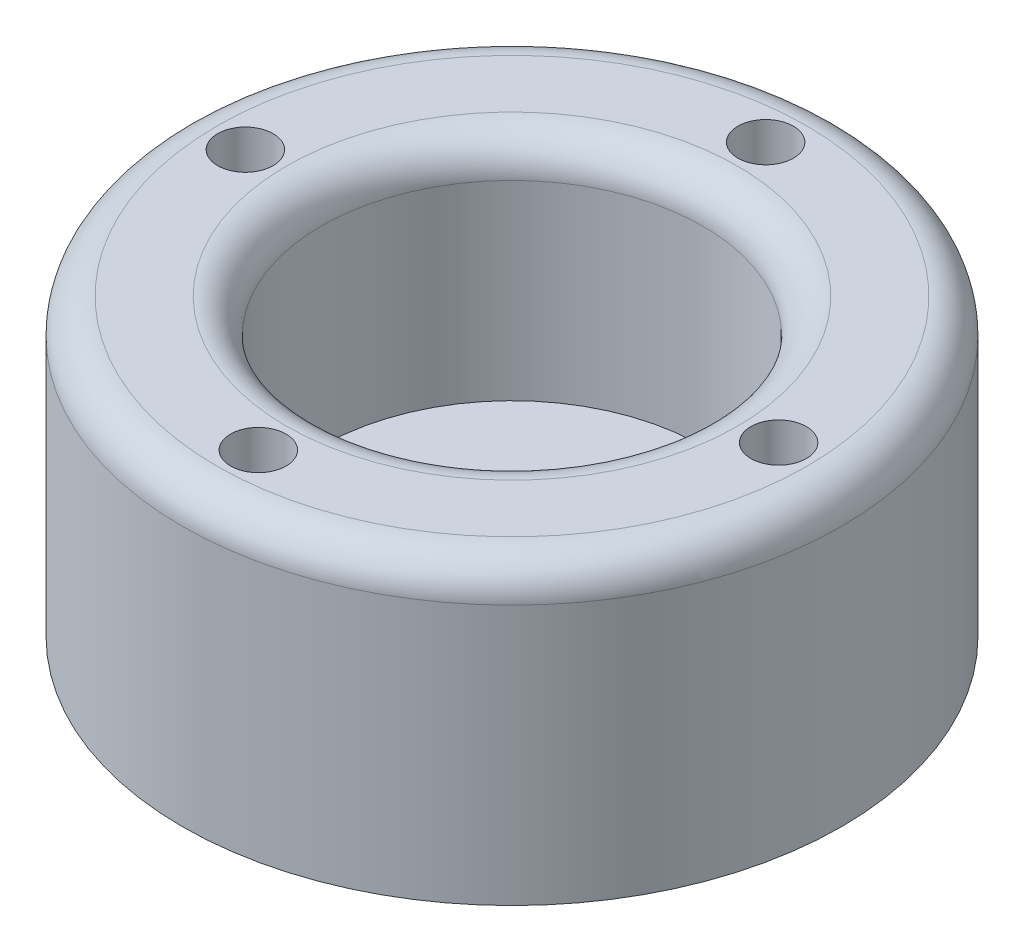
ISO-10303-21;
HEADER;
FILE_DESCRIPTION(('STEP AP214'),'2;1');
FILE_NAME('part.step','',(''),(''),'','','');
FILE_SCHEMA(('AUTOMOTIVE_DESIGN { 1 0 10303 214 1 1 1 1 }'));
ENDSEC;
DATA;
#1=APPLICATION_CONTEXT('core data for automotive mechanical design processes');
#2=APPLICATION_PROTOCOL_DEFINITION('international standard','automotive_design',2000,#1);
#3=PRODUCT_CONTEXT('',#1,'mechanical');
#4=PRODUCT('Part','Part','',(#3));
#5=PRODUCT_RELATED_PRODUCT_CATEGORY('part','',(#4));
#6=PRODUCT_DEFINITION_FORMATION('','',#4);
#7=PRODUCT_DEFINITION_CONTEXT('part definition',#1,'design');
#8=PRODUCT_DEFINITION('design','',#6,#7);
#9=PRODUCT_DEFINITION_SHAPE('','',#8);
#10=(LENGTH_UNIT() NAMED_UNIT(*) SI_UNIT(.MILLI.,.METRE.));
#11=(NAMED_UNIT(*) PLANE_ANGLE_UNIT() SI_UNIT($,.RADIAN.));
#12=(NAMED_UNIT(*) SI_UNIT($,.STERADIAN.) SOLID_ANGLE_UNIT());
#13=UNCERTAINTY_MEASURE_WITH_UNIT(LENGTH_MEASURE(1.E-05),#10,'distance_accuracy_value','');
#14=(GEOMETRIC_REPRESENTATION_CONTEXT(3) GLOBAL_UNCERTAINTY_ASSIGNED_CONTEXT((#13)) GLOBAL_UNIT_ASSIGNED_CONTEXT((#10,
#11,#12)) REPRESENTATION_CONTEXT('',''));
#15=CARTESIAN_POINT('',(0.,0.,0.));
#16=DIRECTION('',(0.,0.,1.));
#17=DIRECTION('',(1.,0.,0.));
#18=AXIS2_PLACEMENT_3D('',#15,#16,#17);
#19=CARTESIAN_POINT('',(0.,17.,0.));
#20=DIRECTION('',(0.,-1.,0.));
#21=DIRECTION('',(0.,0.,-1.));
#22=AXIS2_PLACEMENT_3D('',#19,#20,#21);
#23=CYLINDRICAL_SURFACE('',#22,4.75);
#24=CARTESIAN_POINT('',(0.,0.,0.));
#25=DIRECTION('',(0.,1.,0.));
#26=DIRECTION('',(0.,0.,1.));
#27=AXIS2_PLACEMENT_3D('',#24,#25,#26);
#28=CIRCLE('',#27,4.75);
#29=CARTESIAN_POINT('',(0.,0.,4.75));
#30=VERTEX_POINT('',#29);
#31=EDGE_CURVE('E65',#30,#30,#28,.T.);
#32=ORIENTED_EDGE('',*,*,#31,.F.);
#33=EDGE_LOOP('',(#32));
#34=FACE_BOUND('',#33,.T.);
#35=CARTESIAN_POINT('',(0.,4.,0.));
#36=DIRECTION('',(0.,1.,0.));
#37=DIRECTION('',(0.,0.,1.));
#38=AXIS2_PLACEMENT_3D('',#35,#36,#37);
#39=CIRCLE('',#38,4.75);
#40=CARTESIAN_POINT('',(0.,4.,4.75));
#41=VERTEX_POINT('',#40);
#42=EDGE_CURVE('E129',#41,#41,#39,.F.);
#43=ORIENTED_EDGE('',*,*,#42,.F.);
#44=EDGE_LOOP('',(#43));
#45=FACE_BOUND('',#44,.T.);
#46=ADVANCED_FACE('F37',(#34,#45),#23,.F.);
#47=CARTESIAN_POINT('',(-7.24999999999979,0.,0.373838073698017));
#48=DIRECTION('',(0.,1.,0.));
#49=DIRECTION('',(0.,0.,1.));
#50=AXIS2_PLACEMENT_3D('',#47,#48,#49);
#51=CYLINDRICAL_SURFACE('',#50,1.25000000000033);
#52=CARTESIAN_POINT('',(-7.24999999999979,0.,0.373838073698017));
#53=DIRECTION('',(0.,1.,0.));
#54=DIRECTION('',(0.,0.,1.));
#55=AXIS2_PLACEMENT_3D('',#52,#53,#54);
#56=CIRCLE('',#55,1.25000000000033);
#57=CARTESIAN_POINT('',(-7.24999999999979,0.,1.62383807369834));
#58=VERTEX_POINT('',#57);
#59=EDGE_CURVE('E70',#58,#58,#56,.T.);
#60=ORIENTED_EDGE('',*,*,#59,.F.);
#61=EDGE_LOOP('',(#60));
#62=FACE_BOUND('',#61,.T.);
#63=CARTESIAN_POINT('',(-7.24999999999979,4.,0.373838073698017));
#64=DIRECTION('',(0.,1.,0.));
#65=DIRECTION('',(0.,0.,1.));
#66=AXIS2_PLACEMENT_3D('',#63,#64,#65);
#67=CIRCLE('',#66,1.25000000000033);
#68=CARTESIAN_POINT('',(-7.24999999999979,4.,1.62383807369834));
#69=VERTEX_POINT('',#68);
#70=EDGE_CURVE('E125',#69,#69,#67,.F.);
#71=ORIENTED_EDGE('',*,*,#70,.F.);
#72=EDGE_LOOP('',(#71));
#73=FACE_BOUND('',#72,.T.);
#74=ADVANCED_FACE('F164',(#62,#73),#51,.F.);
#75=CARTESIAN_POINT('',(0.373838073698231,0.,7.24999999999998));
#76=DIRECTION('',(0.,1.,0.));
#77=DIRECTION('',(0.,0.,1.));
#78=AXIS2_PLACEMENT_3D('',#75,#76,#77);
#79=CYLINDRICAL_SURFACE('',#78,1.25000000000045);
#80=CARTESIAN_POINT('',(0.373838073698231,0.,7.24999999999998));
#81=DIRECTION('',(0.,1.,0.));
#82=DIRECTION('',(0.,0.,1.));
#83=AXIS2_PLACEMENT_3D('',#80,#81,#82);
#84=CIRCLE('',#83,1.25000000000045);
#85=CARTESIAN_POINT('',(0.373838073698231,0.,8.50000000000043));
#86=VERTEX_POINT('',#85);
#87=EDGE_CURVE('E74',#86,#86,#84,.T.);
#88=ORIENTED_EDGE('',*,*,#87,.F.);
#89=EDGE_LOOP('',(#88));
#90=FACE_BOUND('',#89,.T.);
#91=CARTESIAN_POINT('',(0.373838073698231,4.,7.24999999999998));
#92=DIRECTION('',(0.,1.,0.));
#93=DIRECTION('',(0.,0.,1.));
#94=AXIS2_PLACEMENT_3D('',#91,#92,#93);
#95=CIRCLE('',#94,1.25000000000045);
#96=CARTESIAN_POINT('',(0.373838073698231,4.,8.50000000000043));
#97=VERTEX_POINT('',#96);
#98=EDGE_CURVE('E133',#97,#97,#95,.F.);
#99=ORIENTED_EDGE('',*,*,#98,.F.);
#100=EDGE_LOOP('',(#99));
#101=FACE_BOUND('',#100,.T.);
#102=ADVANCED_FACE('F158',(#90,#101),#79,.F.);
#103=CARTESIAN_POINT('',(7.2500000000002,0.,-0.373838073698035));
#104=DIRECTION('',(0.,1.,0.));
#105=DIRECTION('',(0.,0.,1.));
#106=AXIS2_PLACEMENT_3D('',#103,#104,#105);
#107=CYLINDRICAL_SURFACE('',#106,1.25000000000017);
#108=CARTESIAN_POINT('',(7.2500000000002,0.,-0.373838073698035));
#109=DIRECTION('',(0.,1.,0.));
#110=DIRECTION('',(0.,0.,1.));
#111=AXIS2_PLACEMENT_3D('',#108,#109,#110);
#112=CIRCLE('',#111,1.25000000000017);
#113=CARTESIAN_POINT('',(7.2500000000002,0.,0.876161926302138));
#114=VERTEX_POINT('',#113);
#115=EDGE_CURVE('E79',#114,#114,#112,.T.);
#116=ORIENTED_EDGE('',*,*,#115,.F.);
#117=EDGE_LOOP('',(#116));
#118=FACE_BOUND('',#117,.T.);
#119=CARTESIAN_POINT('',(7.2500000000002,4.,-0.373838073698035));
#120=DIRECTION('',(0.,1.,0.));
#121=DIRECTION('',(0.,0.,1.));
#122=AXIS2_PLACEMENT_3D('',#119,#120,#121);
#123=CIRCLE('',#122,1.25000000000017);
#124=CARTESIAN_POINT('',(7.2500000000002,4.,0.876161926302138));
#125=VERTEX_POINT('',#124);
#126=EDGE_CURVE('E121',#125,#125,#123,.F.);
#127=ORIENTED_EDGE('',*,*,#126,.F.);
#128=EDGE_LOOP('',(#127));
#129=FACE_BOUND('',#128,.T.);
#130=ADVANCED_FACE('F148',(#118,#129),#107,.F.);
#131=CARTESIAN_POINT('',(-0.37383807369782,0.,-7.25));
#132=DIRECTION('',(0.,1.,0.));
#133=DIRECTION('',(0.,0.,1.));
#134=AXIS2_PLACEMENT_3D('',#131,#132,#133);
#135=CYLINDRICAL_SURFACE('',#134,1.25);
#136=CARTESIAN_POINT('',(-0.37383807369782,0.,-7.25));
#137=DIRECTION('',(0.,1.,0.));
#138=DIRECTION('',(0.,0.,1.));
#139=AXIS2_PLACEMENT_3D('',#136,#137,#138);
#140=CIRCLE('',#139,1.25);
#141=CARTESIAN_POINT('',(-0.37383807369782,0.,-6.));
#142=VERTEX_POINT('',#141);
#143=EDGE_CURVE('E69',#142,#142,#140,.T.);
#144=ORIENTED_EDGE('',*,*,#143,.F.);
#145=EDGE_LOOP('',(#144));
#146=FACE_BOUND('',#145,.T.);
#147=CARTESIAN_POINT('',(-0.37383807369782,4.,-7.25));
#148=DIRECTION('',(0.,1.,0.));
#149=DIRECTION('',(0.,0.,1.));
#150=AXIS2_PLACEMENT_3D('',#147,#148,#149);
#151=CIRCLE('',#150,1.25);
#152=CARTESIAN_POINT('',(-0.37383807369782,4.,-6.));
#153=VERTEX_POINT('',#152);
#154=EDGE_CURVE('E137',#153,#153,#151,.F.);
#155=ORIENTED_EDGE('',*,*,#154,.F.);
#156=EDGE_LOOP('',(#155));
#157=FACE_BOUND('',#156,.T.);
#158=ADVANCED_FACE('F145',(#146,#157),#135,.F.);
#159=CARTESIAN_POINT('',(0.,17.,0.));
#160=DIRECTION('',(0.,1.,0.));
#161=DIRECTION('',(0.,0.,1.));
#162=AXIS2_PLACEMENT_3D('',#159,#160,#161);
#163=PLANE('',#162);
#164=CARTESIAN_POINT('',(0.,17.,0.));
#165=DIRECTION('',(0.,1.,0.));
#166=DIRECTION('',(0.,0.,1.));
#167=AXIS2_PLACEMENT_3D('',#164,#165,#166);
#168=CIRCLE('',#167,17.);
#169=CARTESIAN_POINT('',(0.,17.,17.));
#170=VERTEX_POINT('',#169);
#171=EDGE_CURVE('E50',#170,#170,#168,.T.);
#172=ORIENTED_EDGE('',*,*,#171,.T.);
#173=EDGE_LOOP('',(#172));
#174=FACE_BOUND('',#173,.T.);
#175=CARTESIAN_POINT('',(0.,17.,0.));
#176=DIRECTION('',(0.,1.,0.));
#177=DIRECTION('',(0.,0.,1.));
#178=AXIS2_PLACEMENT_3D('',#175,#176,#177);
#179=CIRCLE('',#178,13.);
#180=CARTESIAN_POINT('',(0.,17.,13.));
#181=VERTEX_POINT('',#180);
#182=EDGE_CURVE('E55',#181,#181,#179,.F.);
#183=ORIENTED_EDGE('',*,*,#182,.T.);
#184=EDGE_LOOP('',(#183));
#185=FACE_BOUND('',#184,.T.);
#186=CARTESIAN_POINT('',(-0.37383807369782,17.,-15.));
#187=DIRECTION('',(0.,1.,0.));
#188=DIRECTION('',(0.,0.,1.));
#189=AXIS2_PLACEMENT_3D('',#186,#187,#188);
#190=CIRCLE('',#189,1.6);
#191=CARTESIAN_POINT('',(-0.37383807369782,17.,-13.4));
#192=VERTEX_POINT('',#191);
#193=EDGE_CURVE('E111',#192,#192,#190,.T.);
#194=ORIENTED_EDGE('',*,*,#193,.F.);
#195=EDGE_LOOP('',(#194));
#196=FACE_BOUND('',#195,.T.);
#197=CARTESIAN_POINT('',(15.0000000000004,17.,-0.37383807369825));
#198=DIRECTION('',(0.,1.,0.));
#199=DIRECTION('',(0.,0.,1.));
#200=AXIS2_PLACEMENT_3D('',#197,#198,#199);
#201=CIRCLE('',#200,1.6);
#202=CARTESIAN_POINT('',(15.0000000000004,17.,1.22616192630175));
#203=VERTEX_POINT('',#202);
#204=EDGE_CURVE('E103',#203,#203,#201,.T.);
#205=ORIENTED_EDGE('',*,*,#204,.F.);
#206=EDGE_LOOP('',(#205));
#207=FACE_BOUND('',#206,.T.);
#208=CARTESIAN_POINT('',(0.373838073698662,17.,15.));
#209=DIRECTION('',(0.,1.,0.));
#210=DIRECTION('',(0.,0.,1.));
#211=AXIS2_PLACEMENT_3D('',#208,#209,#210);
#212=CIRCLE('',#211,1.6);
#213=CARTESIAN_POINT('',(0.373838073698662,17.,16.6));
#214=VERTEX_POINT('',#213);
#215=EDGE_CURVE('E95',#214,#214,#212,.T.);
#216=ORIENTED_EDGE('',*,*,#215,.F.);
#217=EDGE_LOOP('',(#216));
#218=FACE_BOUND('',#217,.T.);
#219=CARTESIAN_POINT('',(-14.9999999999996,17.,0.373838073698234));
#220=DIRECTION('',(0.,1.,0.));
#221=DIRECTION('',(0.,0.,1.));
#222=AXIS2_PLACEMENT_3D('',#219,#220,#221);
#223=CIRCLE('',#222,1.6);
#224=CARTESIAN_POINT('',(-14.9999999999996,17.,1.97383807369823));
#225=VERTEX_POINT('',#224);
#226=EDGE_CURVE('E86',#225,#225,#223,.T.);
#227=ORIENTED_EDGE('',*,*,#226,.F.);
#228=EDGE_LOOP('',(#227));
#229=FACE_BOUND('',#228,.T.);
#230=ADVANCED_FACE('F147',(#174,#185,#196,#207,#218,#229),#163,.T.);
#231=CARTESIAN_POINT('',(0.,0.,0.));
#232=DIRECTION('',(0.,1.,0.));
#233=DIRECTION('',(0.,0.,1.));
#234=AXIS2_PLACEMENT_3D('',#231,#232,#233);
#235=PLANE('',#234);
#236=ORIENTED_EDGE('',*,*,#143,.T.);
#237=EDGE_LOOP('',(#236));
#238=FACE_BOUND('',#237,.T.);
#239=ORIENTED_EDGE('',*,*,#115,.T.);
#240=EDGE_LOOP('',(#239));
#241=FACE_BOUND('',#240,.T.);
#242=ORIENTED_EDGE('',*,*,#87,.T.);
#243=EDGE_LOOP('',(#242));
#244=FACE_BOUND('',#243,.T.);
#245=ORIENTED_EDGE('',*,*,#59,.T.);
#246=EDGE_LOOP('',(#245));
#247=FACE_BOUND('',#246,.T.);
#248=CARTESIAN_POINT('',(0.,0.,0.));
#249=DIRECTION('',(0.,1.,0.));
#250=DIRECTION('',(0.,0.,1.));
#251=AXIS2_PLACEMENT_3D('',#248,#249,#250);
#252=CIRCLE('',#251,19.);
#253=CARTESIAN_POINT('',(0.,0.,19.));
#254=VERTEX_POINT('',#253);
#255=EDGE_CURVE('E61',#254,#254,#252,.T.);
#256=ORIENTED_EDGE('',*,*,#255,.F.);
#257=EDGE_LOOP('',(#256));
#258=FACE_BOUND('',#257,.T.);
#259=ORIENTED_EDGE('',*,*,#31,.T.);
#260=EDGE_LOOP('',(#259));
#261=FACE_BOUND('',#260,.T.);
#262=ADVANCED_FACE('F155',(#238,#241,#244,#247,#258,#261),#235,.F.);
#263=CARTESIAN_POINT('',(0.,17.,0.));
#264=DIRECTION('',(0.,-1.,0.));
#265=DIRECTION('',(0.,0.,-1.));
#266=AXIS2_PLACEMENT_3D('',#263,#264,#265);
#267=CYLINDRICAL_SURFACE('',#266,19.);
#268=CARTESIAN_POINT('',(0.,15.,0.));
#269=DIRECTION('',(0.,1.,0.));
#270=DIRECTION('',(0.,0.,1.));
#271=AXIS2_PLACEMENT_3D('',#268,#269,#270);
#272=CIRCLE('',#271,19.);
#273=CARTESIAN_POINT('',(0.,15.,19.));
#274=VERTEX_POINT('',#273);
#275=EDGE_CURVE('E45',#274,#274,#272,.F.);
#276=ORIENTED_EDGE('',*,*,#275,.T.);
#277=EDGE_LOOP('',(#276));
#278=FACE_BOUND('',#277,.T.);
#279=ORIENTED_EDGE('',*,*,#255,.T.);
#280=EDGE_LOOP('',(#279));
#281=FACE_BOUND('',#280,.T.);
#282=ADVANCED_FACE('F178',(#278,#281),#267,.T.);
#283=CARTESIAN_POINT('',(-14.9999999999996,2.,0.373838073698234));
#284=DIRECTION('',(0.,1.,0.));
#285=DIRECTION('',(0.,0.,1.));
#286=AXIS2_PLACEMENT_3D('',#283,#284,#285);
#287=CYLINDRICAL_SURFACE('',#286,1.6);
#288=CARTESIAN_POINT('',(-14.9999999999996,2.,0.373838073698234));
#289=DIRECTION('',(0.,1.,0.));
#290=DIRECTION('',(0.,0.,1.));
#291=AXIS2_PLACEMENT_3D('',#288,#289,#290);
#292=CIRCLE('',#291,1.6);
#293=CARTESIAN_POINT('',(-14.9999999999996,2.,1.97383807369823));
#294=VERTEX_POINT('',#293);
#295=EDGE_CURVE('E90',#294,#294,#292,.T.);
#296=ORIENTED_EDGE('',*,*,#295,.F.);
#297=EDGE_LOOP('',(#296));
#298=FACE_BOUND('',#297,.T.);
#299=ORIENTED_EDGE('',*,*,#226,.T.);
#300=EDGE_LOOP('',(#299));
#301=FACE_BOUND('',#300,.T.);
#302=ADVANCED_FACE('F181',(#298,#301),#287,.F.);
#303=CARTESIAN_POINT('',(-14.9999999999996,2.,0.373838073698234));
#304=DIRECTION('',(0.,1.,0.));
#305=DIRECTION('',(0.,0.,1.));
#306=AXIS2_PLACEMENT_3D('',#303,#304,#305);
#307=PLANE('',#306);
#308=ORIENTED_EDGE('',*,*,#295,.T.);
#309=EDGE_LOOP('',(#308));
#310=FACE_BOUND('',#309,.T.);
#311=ADVANCED_FACE('F206',(#310),#307,.T.);
#312=CARTESIAN_POINT('',(0.373838073698662,2.,15.));
#313=DIRECTION('',(0.,1.,0.));
#314=DIRECTION('',(0.,0.,1.));
#315=AXIS2_PLACEMENT_3D('',#312,#313,#314);
#316=CYLINDRICAL_SURFACE('',#315,1.6);
#317=CARTESIAN_POINT('',(0.373838073698662,2.,15.));
#318=DIRECTION('',(0.,1.,0.));
#319=DIRECTION('',(0.,0.,1.));
#320=AXIS2_PLACEMENT_3D('',#317,#318,#319);
#321=CIRCLE('',#320,1.6);
#322=CARTESIAN_POINT('',(0.373838073698662,2.,16.6));
#323=VERTEX_POINT('',#322);
#324=EDGE_CURVE('E99',#323,#323,#321,.T.);
#325=ORIENTED_EDGE('',*,*,#324,.F.);
#326=EDGE_LOOP('',(#325));
#327=FACE_BOUND('',#326,.T.);
#328=ORIENTED_EDGE('',*,*,#215,.T.);
#329=EDGE_LOOP('',(#328));
#330=FACE_BOUND('',#329,.T.);
#331=ADVANCED_FACE('F211',(#327,#330),#316,.F.);
#332=CARTESIAN_POINT('',(0.373838073698662,2.,15.));
#333=DIRECTION('',(0.,1.,0.));
#334=DIRECTION('',(0.,0.,1.));
#335=AXIS2_PLACEMENT_3D('',#332,#333,#334);
#336=PLANE('',#335);
#337=ORIENTED_EDGE('',*,*,#324,.T.);
#338=EDGE_LOOP('',(#337));
#339=FACE_BOUND('',#338,.T.);
#340=ADVANCED_FACE('F218',(#339),#336,.T.);
#341=CARTESIAN_POINT('',(15.0000000000004,2.,-0.37383807369825));
#342=DIRECTION('',(0.,1.,0.));
#343=DIRECTION('',(0.,0.,1.));
#344=AXIS2_PLACEMENT_3D('',#341,#342,#343);
#345=CYLINDRICAL_SURFACE('',#344,1.6);
#346=CARTESIAN_POINT('',(15.0000000000004,2.,-0.37383807369825));
#347=DIRECTION('',(0.,1.,0.));
#348=DIRECTION('',(0.,0.,1.));
#349=AXIS2_PLACEMENT_3D('',#346,#347,#348);
#350=CIRCLE('',#349,1.6);
#351=CARTESIAN_POINT('',(15.0000000000004,2.,1.22616192630175));
#352=VERTEX_POINT('',#351);
#353=EDGE_CURVE('E107',#352,#352,#350,.T.);
#354=ORIENTED_EDGE('',*,*,#353,.F.);
#355=EDGE_LOOP('',(#354));
#356=FACE_BOUND('',#355,.T.);
#357=ORIENTED_EDGE('',*,*,#204,.T.);
#358=EDGE_LOOP('',(#357));
#359=FACE_BOUND('',#358,.T.);
#360=ADVANCED_FACE('F222',(#356,#359),#345,.F.);
#361=CARTESIAN_POINT('',(15.0000000000004,2.,-0.37383807369825));
#362=DIRECTION('',(0.,1.,0.));
#363=DIRECTION('',(0.,0.,1.));
#364=AXIS2_PLACEMENT_3D('',#361,#362,#363);
#365=PLANE('',#364);
#366=ORIENTED_EDGE('',*,*,#353,.T.);
#367=EDGE_LOOP('',(#366));
#368=FACE_BOUND('',#367,.T.);
#369=ADVANCED_FACE('F226',(#368),#365,.T.);
#370=CARTESIAN_POINT('',(-0.37383807369782,2.,-15.));
#371=DIRECTION('',(0.,1.,0.));
#372=DIRECTION('',(0.,0.,1.));
#373=AXIS2_PLACEMENT_3D('',#370,#371,#372);
#374=CYLINDRICAL_SURFACE('',#373,1.6);
#375=CARTESIAN_POINT('',(-0.37383807369782,2.,-15.));
#376=DIRECTION('',(0.,1.,0.));
#377=DIRECTION('',(0.,0.,1.));
#378=AXIS2_PLACEMENT_3D('',#375,#376,#377);
#379=CIRCLE('',#378,1.6);
#380=CARTESIAN_POINT('',(-0.37383807369782,2.,-13.4));
#381=VERTEX_POINT('',#380);
#382=EDGE_CURVE('E75',#381,#381,#379,.T.);
#383=ORIENTED_EDGE('',*,*,#382,.F.);
#384=EDGE_LOOP('',(#383));
#385=FACE_BOUND('',#384,.T.);
#386=ORIENTED_EDGE('',*,*,#193,.T.);
#387=EDGE_LOOP('',(#386));
#388=FACE_BOUND('',#387,.T.);
#389=ADVANCED_FACE('F230',(#385,#388),#374,.F.);
#390=CARTESIAN_POINT('',(-0.37383807369782,2.,-15.));
#391=DIRECTION('',(0.,1.,0.));
#392=DIRECTION('',(0.,0.,1.));
#393=AXIS2_PLACEMENT_3D('',#390,#391,#392);
#394=PLANE('',#393);
#395=ORIENTED_EDGE('',*,*,#382,.T.);
#396=EDGE_LOOP('',(#395));
#397=FACE_BOUND('',#396,.T.);
#398=ADVANCED_FACE('F234',(#397),#394,.T.);
#399=CARTESIAN_POINT('',(0.,4.,0.));
#400=DIRECTION('',(0.,1.,0.));
#401=DIRECTION('',(0.,0.,1.));
#402=AXIS2_PLACEMENT_3D('',#399,#400,#401);
#403=CYLINDRICAL_SURFACE('',#402,11.);
#404=CARTESIAN_POINT('',(0.,15.,0.));
#405=DIRECTION('',(0.,1.,0.));
#406=DIRECTION('',(0.,0.,1.));
#407=AXIS2_PLACEMENT_3D('',#404,#405,#406);
#408=CIRCLE('',#407,11.);
#409=CARTESIAN_POINT('',(0.,15.,11.));
#410=VERTEX_POINT('',#409);
#411=EDGE_CURVE('E10',#410,#410,#408,.T.);
#412=CARTESIAN_POINT('',(0.,4.,0.));
#413=DIRECTION('',(0.,1.,0.));
#414=DIRECTION('',(0.,0.,1.));
#415=AXIS2_PLACEMENT_3D('',#412,#413,#414);
#416=CIRCLE('',#415,11.);
#417=CARTESIAN_POINT('',(0.,4.,11.));
#418=VERTEX_POINT('',#417);
#419=EDGE_CURVE('E91',#418,#418,#416,.T.);
#420=CARTESIAN_POINT('',(0.,15.,11.));
#421=CARTESIAN_POINT('',(0.,14.8854166666667,11.));
#422=CARTESIAN_POINT('',(0.,14.7708333333333,11.));
#423=CARTESIAN_POINT('',(0.,14.5416666666667,11.));
#424=CARTESIAN_POINT('',(0.,14.4270833333333,11.));
#425=CARTESIAN_POINT('',(0.,14.1979166666667,11.));
#426=CARTESIAN_POINT('',(0.,14.0833333333333,11.));
#427=CARTESIAN_POINT('',(0.,13.8541666666667,11.));
#428=CARTESIAN_POINT('',(0.,13.7395833333333,11.));
#429=CARTESIAN_POINT('',(0.,13.5104166666667,11.));
#430=CARTESIAN_POINT('',(0.,13.3958333333333,11.));
#431=CARTESIAN_POINT('',(0.,13.1666666666667,11.));
#432=CARTESIAN_POINT('',(0.,13.0520833333333,11.));
#433=CARTESIAN_POINT('',(0.,12.8229166666667,11.));
#434=CARTESIAN_POINT('',(0.,12.7083333333333,11.));
#435=CARTESIAN_POINT('',(0.,12.4791666666667,11.));
#436=CARTESIAN_POINT('',(0.,12.3645833333333,11.));
#437=CARTESIAN_POINT('',(0.,12.1354166666667,11.));
#438=CARTESIAN_POINT('',(0.,12.0208333333333,11.));
#439=CARTESIAN_POINT('',(0.,11.7916666666667,11.));
#440=CARTESIAN_POINT('',(0.,11.6770833333333,11.));
#441=CARTESIAN_POINT('',(0.,11.4479166666667,11.));
#442=CARTESIAN_POINT('',(0.,11.3333333333333,11.));
#443=CARTESIAN_POINT('',(0.,11.1041666666667,11.));
#444=CARTESIAN_POINT('',(0.,10.9895833333333,11.));
#445=CARTESIAN_POINT('',(0.,10.7604166666667,11.));
#446=CARTESIAN_POINT('',(0.,10.6458333333333,11.));
#447=CARTESIAN_POINT('',(0.,10.4166666666667,11.));
#448=CARTESIAN_POINT('',(0.,10.3020833333333,11.));
#449=CARTESIAN_POINT('',(0.,10.0729166666667,11.));
#450=CARTESIAN_POINT('',(0.,9.95833333333333,11.));
#451=CARTESIAN_POINT('',(0.,9.72916666666667,11.));
#452=CARTESIAN_POINT('',(0.,9.61458333333333,11.));
#453=CARTESIAN_POINT('',(0.,9.38541666666667,11.));
#454=CARTESIAN_POINT('',(0.,9.27083333333333,11.));
#455=CARTESIAN_POINT('',(0.,9.04166666666667,11.));
#456=CARTESIAN_POINT('',(0.,8.92708333333333,11.));
#457=CARTESIAN_POINT('',(0.,8.69791666666667,11.));
#458=CARTESIAN_POINT('',(0.,8.58333333333333,11.));
#459=CARTESIAN_POINT('',(0.,8.35416666666667,11.));
#460=CARTESIAN_POINT('',(0.,8.23958333333333,11.));
#461=CARTESIAN_POINT('',(0.,8.01041666666667,11.));
#462=CARTESIAN_POINT('',(0.,7.89583333333333,11.));
#463=CARTESIAN_POINT('',(0.,7.66666666666667,11.));
#464=CARTESIAN_POINT('',(0.,7.55208333333333,11.));
#465=CARTESIAN_POINT('',(0.,7.32291666666667,11.));
#466=CARTESIAN_POINT('',(0.,7.20833333333333,11.));
#467=CARTESIAN_POINT('',(0.,6.97916666666667,11.));
#468=CARTESIAN_POINT('',(0.,6.86458333333333,11.));
#469=CARTESIAN_POINT('',(0.,6.63541666666667,11.));
#470=CARTESIAN_POINT('',(0.,6.52083333333333,11.));
#471=CARTESIAN_POINT('',(0.,6.29166666666667,11.));
#472=CARTESIAN_POINT('',(0.,6.17708333333334,11.));
#473=CARTESIAN_POINT('',(0.,5.94791666666667,11.));
#474=CARTESIAN_POINT('',(0.,5.83333333333334,11.));
#475=CARTESIAN_POINT('',(0.,5.60416666666667,11.));
#476=CARTESIAN_POINT('',(0.,5.48958333333333,11.));
#477=CARTESIAN_POINT('',(0.,5.26041666666667,11.));
#478=CARTESIAN_POINT('',(0.,5.14583333333333,11.));
#479=CARTESIAN_POINT('',(0.,4.91666666666667,11.));
#480=CARTESIAN_POINT('',(0.,4.80208333333334,11.));
#481=CARTESIAN_POINT('',(0.,4.57291666666667,11.));
#482=CARTESIAN_POINT('',(0.,4.45833333333334,11.));
#483=CARTESIAN_POINT('',(0.,4.22916666666667,11.));
#484=CARTESIAN_POINT('',(0.,4.11458333333334,11.));
#485=CARTESIAN_POINT('',(0.,4.,11.));
#486=B_SPLINE_CURVE_WITH_KNOTS('',3,(#420,#421,#422,#423,#424,#425,#426,#427,#428,#429,#430,
#431,#432,#433,#434,#435,#436,#437,#438,#439,#440,#441,#442,#443,#444,#445,#446,#447,#448,#449,
#450,#451,#452,#453,#454,#455,#456,#457,#458,#459,#460,#461,#462,#463,#464,#465,#466,#467,#468,
#469,#470,#471,#472,#473,#474,#475,#476,#477,#478,#479,#480,#481,#482,#483,#484,#485),
.UNSPECIFIED.,.F.,.F.,(4,2,2,2,2,2,2,2,2,2,2,2,2,2,2,2,2,2,2,2,2,2,2,2,2,2,2,2,2,2,2,2,4),(0.,
0.34375,0.687500000000001,1.03125,1.375,1.71875,2.0625,2.40625,2.75,3.09375,3.4375,3.78125,
4.125,4.46875,4.8125,5.15625,5.5,5.84375,6.1875,6.53125,6.875,7.21875,7.5625,7.90625,8.25,
8.59375,8.9375,9.28125,9.625,9.96875,10.3125,10.65625,11.),.UNSPECIFIED.);
#487=EDGE_CURVE('BSEAM190',#410,#418,#486,.T.);
#488=ORIENTED_EDGE('',*,*,#411,.T.);
#489=ORIENTED_EDGE('',*,*,#419,.F.);
#490=ORIENTED_EDGE('',*,*,#487,.T.);
#491=ORIENTED_EDGE('',*,*,#487,.F.);
#492=EDGE_LOOP('',(#488,#490,#489,#491));
#493=FACE_BOUND('',#492,.T.);
#494=ADVANCED_FACE('F190',(#493),#403,.F.);
#495=CARTESIAN_POINT('',(0.,4.,0.));
#496=DIRECTION('',(0.,1.,0.));
#497=DIRECTION('',(0.,0.,1.));
#498=AXIS2_PLACEMENT_3D('',#495,#496,#497);
#499=PLANE('',#498);
#500=ORIENTED_EDGE('',*,*,#154,.T.);
#501=EDGE_LOOP('',(#500));
#502=FACE_BOUND('',#501,.T.);
#503=ORIENTED_EDGE('',*,*,#98,.T.);
#504=EDGE_LOOP('',(#503));
#505=FACE_BOUND('',#504,.T.);
#506=ORIENTED_EDGE('',*,*,#42,.T.);
#507=EDGE_LOOP('',(#506));
#508=FACE_BOUND('',#507,.T.);
#509=ORIENTED_EDGE('',*,*,#70,.T.);
#510=EDGE_LOOP('',(#509));
#511=FACE_BOUND('',#510,.T.);
#512=ORIENTED_EDGE('',*,*,#126,.T.);
#513=EDGE_LOOP('',(#512));
#514=FACE_BOUND('',#513,.T.);
#515=ORIENTED_EDGE('',*,*,#419,.T.);
#516=EDGE_LOOP('',(#515));
#517=FACE_BOUND('',#516,.T.);
#518=ADVANCED_FACE('F142',(#502,#505,#508,#511,#514,#517),#499,.T.);
#519=CARTESIAN_POINT('',(0.,15.,0.));
#520=DIRECTION('',(0.,1.,0.));
#521=DIRECTION('',(0.,0.,1.));
#522=AXIS2_PLACEMENT_3D('',#519,#520,#521);
#523=TOROIDAL_SURFACE('',#522,17.,2.);
#524=ORIENTED_EDGE('',*,*,#275,.F.);
#525=EDGE_LOOP('',(#524));
#526=FACE_BOUND('',#525,.T.);
#527=ORIENTED_EDGE('',*,*,#171,.F.);
#528=EDGE_LOOP('',(#527));
#529=FACE_BOUND('',#528,.T.);
#530=ADVANCED_FACE('F182',(#526,#529),#523,.T.);
#531=CARTESIAN_POINT('',(0.,15.,0.));
#532=DIRECTION('',(0.,1.,0.));
#533=DIRECTION('',(0.,0.,1.));
#534=AXIS2_PLACEMENT_3D('',#531,#532,#533);
#535=TOROIDAL_SURFACE('',#534,13.,2.);
#536=ORIENTED_EDGE('',*,*,#182,.F.);
#537=EDGE_LOOP('',(#536));
#538=FACE_BOUND('',#537,.T.);
#539=ORIENTED_EDGE('',*,*,#411,.F.);
#540=EDGE_LOOP('',(#539));
#541=FACE_BOUND('',#540,.T.);
#542=ADVANCED_FACE('F39',(#538,#541),#535,.T.);
#543=CLOSED_SHELL('',(#46,#74,#102,#130,#158,#230,#262,#282,#302,#311,#331,#340,#360,#369,#389,
#398,#494,#518,#530,#542));
#544=MANIFOLD_SOLID_BREP('B2',#543);
#545=ADVANCED_BREP_SHAPE_REPRESENTATION('',(#18,#544),#14);
#546=SHAPE_DEFINITION_REPRESENTATION(#9,#545);
ENDSEC;
END-ISO-10303-21;
